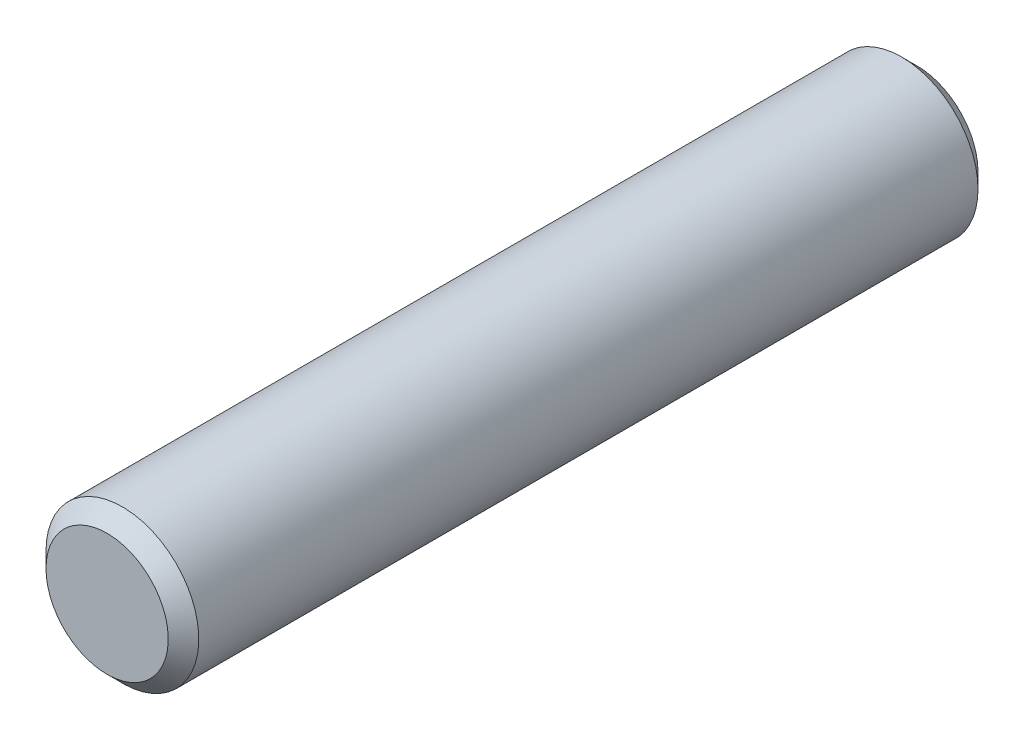
ISO-10303-21;
HEADER;
FILE_DESCRIPTION(('STEP AP214'),'2;1');
FILE_NAME('part.step','',(''),(''),'','','');
FILE_SCHEMA(('AUTOMOTIVE_DESIGN { 1 0 10303 214 1 1 1 1 }'));
ENDSEC;
DATA;
#1=APPLICATION_CONTEXT('core data for automotive mechanical design processes');
#2=APPLICATION_PROTOCOL_DEFINITION('international standard','automotive_design',2000,#1);
#3=PRODUCT_CONTEXT('',#1,'mechanical');
#4=PRODUCT('Part','Part','',(#3));
#5=PRODUCT_RELATED_PRODUCT_CATEGORY('part','',(#4));
#6=PRODUCT_DEFINITION_FORMATION('','',#4);
#7=PRODUCT_DEFINITION_CONTEXT('part definition',#1,'design');
#8=PRODUCT_DEFINITION('design','',#6,#7);
#9=PRODUCT_DEFINITION_SHAPE('','',#8);
#10=(LENGTH_UNIT() NAMED_UNIT(*) SI_UNIT(.MILLI.,.METRE.));
#11=(NAMED_UNIT(*) PLANE_ANGLE_UNIT() SI_UNIT($,.RADIAN.));
#12=(NAMED_UNIT(*) SI_UNIT($,.STERADIAN.) SOLID_ANGLE_UNIT());
#13=UNCERTAINTY_MEASURE_WITH_UNIT(LENGTH_MEASURE(1.E-05),#10,'distance_accuracy_value','');
#14=(GEOMETRIC_REPRESENTATION_CONTEXT(3) GLOBAL_UNCERTAINTY_ASSIGNED_CONTEXT((#13)) GLOBAL_UNIT_ASSIGNED_CONTEXT((#10,
#11,#12)) REPRESENTATION_CONTEXT('',''));
#15=CARTESIAN_POINT('',(0.,0.,0.));
#16=DIRECTION('',(0.,0.,1.));
#17=DIRECTION('',(1.,0.,0.));
#18=AXIS2_PLACEMENT_3D('',#15,#16,#17);
#19=CARTESIAN_POINT('',(-4.99058372977763,9.60451950556306,0.));
#20=DIRECTION('',(0.,0.,-1.));
#21=DIRECTION('',(-1.,0.,0.));
#22=AXIS2_PLACEMENT_3D('',#19,#20,#21);
#23=PLANE('',#22);
#24=CARTESIAN_POINT('',(-4.99058372977763,9.60451950556306,-1.70530256582424E-10));
#25=DIRECTION('',(0.,0.,1.));
#26=DIRECTION('',(1.,0.,0.));
#27=AXIS2_PLACEMENT_3D('',#24,#25,#26);
#28=CIRCLE('',#27,2.00000000020944);
#29=CARTESIAN_POINT('',(-2.99058372956819,9.60451950556306,-1.70530256582424E-10));
#30=VERTEX_POINT('',#29);
#31=EDGE_CURVE('E19',#30,#30,#28,.T.);
#32=ORIENTED_EDGE('',*,*,#31,.F.);
#33=EDGE_LOOP('',(#32));
#34=FACE_BOUND('',#33,.T.);
#35=ADVANCED_FACE('F15',(#34),#23,.T.);
#36=CARTESIAN_POINT('',(-4.99058372977763,9.60451950556306,26.5));
#37=DIRECTION('',(0.,0.,-1.));
#38=DIRECTION('',(-1.,0.,0.));
#39=AXIS2_PLACEMENT_3D('',#36,#37,#38);
#40=PLANE('',#39);
#41=CARTESIAN_POINT('',(-4.99058372977763,9.60451950556306,26.500000000226));
#42=DIRECTION('',(0.,0.,-1.));
#43=DIRECTION('',(-1.,0.,0.));
#44=AXIS2_PLACEMENT_3D('',#41,#42,#43);
#45=CIRCLE('',#44,2.00000000009575);
#46=CARTESIAN_POINT('',(-6.99058372987338,9.60451950556306,26.500000000226));
#47=VERTEX_POINT('',#46);
#48=EDGE_CURVE('E28',#47,#47,#45,.T.);
#49=ORIENTED_EDGE('',*,*,#48,.F.);
#50=EDGE_LOOP('',(#49));
#51=FACE_BOUND('',#50,.T.);
#52=ADVANCED_FACE('F40',(#51),#40,.F.);
#53=CARTESIAN_POINT('',(-4.99058372977763,9.60451950556306,0.500000000272394));
#54=DIRECTION('',(0.,0.,1.));
#55=DIRECTION('',(1.,0.,0.));
#56=AXIS2_PLACEMENT_3D('',#53,#54,#55);
#57=CONICAL_SURFACE('',#56,2.49999999974287,0.785398162487954);
#58=ORIENTED_EDGE('',*,*,#31,.T.);
#59=EDGE_LOOP('',(#58));
#60=FACE_BOUND('',#59,.T.);
#61=CARTESIAN_POINT('',(-4.99058372977763,9.60451950556306,0.500000000000007));
#62=DIRECTION('',(0.,0.,1.));
#63=DIRECTION('',(-1.,0.,0.));
#64=AXIS2_PLACEMENT_3D('',#61,#62,#63);
#65=CIRCLE('',#64,2.50000000000001);
#66=CARTESIAN_POINT('',(-7.49058372977764,9.60451950556306,0.500000000000007));
#67=VERTEX_POINT('',#66);
#68=EDGE_CURVE('E23',#67,#67,#65,.T.);
#69=ORIENTED_EDGE('',*,*,#68,.F.);
#70=EDGE_LOOP('',(#69));
#71=FACE_BOUND('',#70,.T.);
#72=ADVANCED_FACE('F36',(#60,#71),#57,.T.);
#73=CARTESIAN_POINT('',(-4.99058372977763,9.60451950556306,25.9999999996694));
#74=DIRECTION('',(0.,0.,-1.));
#75=DIRECTION('',(-1.,0.,0.));
#76=AXIS2_PLACEMENT_3D('',#73,#74,#75);
#77=CONICAL_SURFACE('',#76,2.49999999974287,0.785398162487954);
#78=ORIENTED_EDGE('',*,*,#48,.T.);
#79=EDGE_LOOP('',(#78));
#80=FACE_BOUND('',#79,.T.);
#81=CARTESIAN_POINT('',(-4.99058372977763,9.60451950556306,26.));
#82=DIRECTION('',(0.,0.,1.));
#83=DIRECTION('',(-1.,0.,0.));
#84=AXIS2_PLACEMENT_3D('',#81,#82,#83);
#85=CIRCLE('',#84,2.50000000000001);
#86=CARTESIAN_POINT('',(-7.49058372977764,9.60451950556306,26.));
#87=VERTEX_POINT('',#86);
#88=EDGE_CURVE('E10',#87,#87,#85,.F.);
#89=ORIENTED_EDGE('',*,*,#88,.F.);
#90=EDGE_LOOP('',(#89));
#91=FACE_BOUND('',#90,.T.);
#92=ADVANCED_FACE('F49',(#80,#91),#77,.T.);
#93=CARTESIAN_POINT('',(-4.99058372977763,9.60451950556306,0.500000000000007));
#94=DIRECTION('',(0.,0.,1.));
#95=DIRECTION('',(1.,0.,0.));
#96=AXIS2_PLACEMENT_3D('',#93,#94,#95);
#97=CYLINDRICAL_SURFACE('',#96,2.50000000000001);
#98=ORIENTED_EDGE('',*,*,#68,.T.);
#99=EDGE_LOOP('',(#98));
#100=FACE_BOUND('',#99,.T.);
#101=ORIENTED_EDGE('',*,*,#88,.T.);
#102=EDGE_LOOP('',(#101));
#103=FACE_BOUND('',#102,.T.);
#104=ADVANCED_FACE('F17',(#100,#103),#97,.T.);
#105=CLOSED_SHELL('',(#35,#52,#72,#92,#104));
#106=MANIFOLD_SOLID_BREP('B1',#105);
#107=ADVANCED_BREP_SHAPE_REPRESENTATION('',(#18,#106),#14);
#108=SHAPE_DEFINITION_REPRESENTATION(#9,#107);
ENDSEC;
END-ISO-10303-21;
